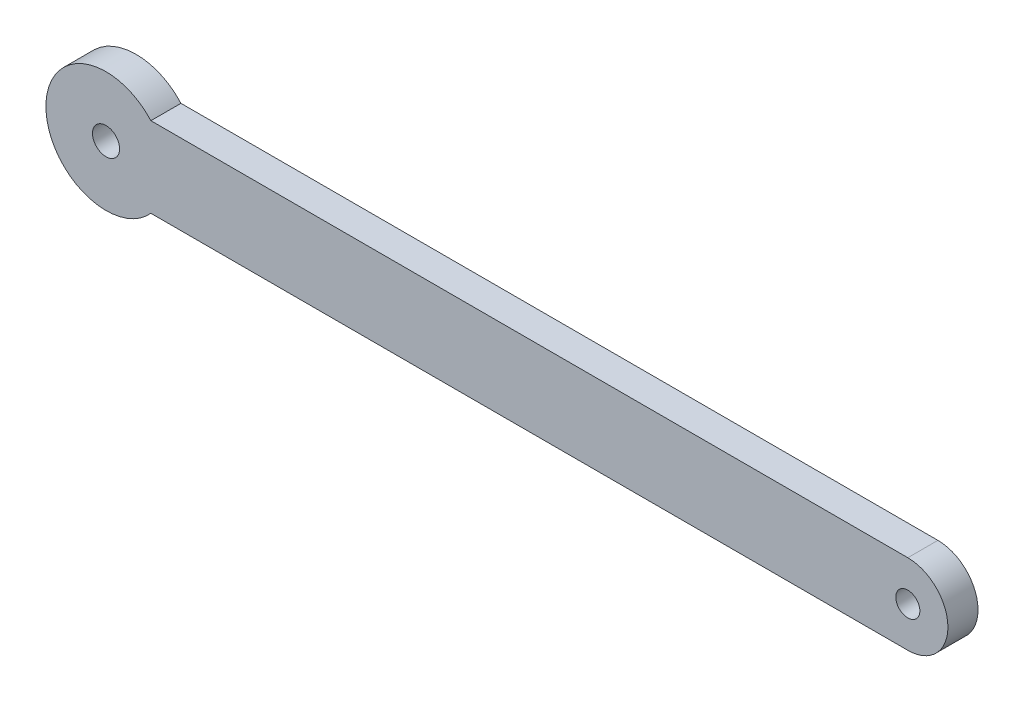
ISO-10303-21;
HEADER;
FILE_DESCRIPTION(('STEP AP214'),'2;1');
FILE_NAME('part.step','',(''),(''),'','','');
FILE_SCHEMA(('AUTOMOTIVE_DESIGN { 1 0 10303 214 1 1 1 1 }'));
ENDSEC;
DATA;
#1=APPLICATION_CONTEXT('core data for automotive mechanical design processes');
#2=APPLICATION_PROTOCOL_DEFINITION('international standard','automotive_design',2000,#1);
#3=PRODUCT_CONTEXT('',#1,'mechanical');
#4=PRODUCT('Part','Part','',(#3));
#5=PRODUCT_RELATED_PRODUCT_CATEGORY('part','',(#4));
#6=PRODUCT_DEFINITION_FORMATION('','',#4);
#7=PRODUCT_DEFINITION_CONTEXT('part definition',#1,'design');
#8=PRODUCT_DEFINITION('design','',#6,#7);
#9=PRODUCT_DEFINITION_SHAPE('','',#8);
#10=(LENGTH_UNIT() NAMED_UNIT(*) SI_UNIT(.MILLI.,.METRE.));
#11=(NAMED_UNIT(*) PLANE_ANGLE_UNIT() SI_UNIT($,.RADIAN.));
#12=(NAMED_UNIT(*) SI_UNIT($,.STERADIAN.) SOLID_ANGLE_UNIT());
#13=UNCERTAINTY_MEASURE_WITH_UNIT(LENGTH_MEASURE(1.E-05),#10,'distance_accuracy_value','');
#14=(GEOMETRIC_REPRESENTATION_CONTEXT(3) GLOBAL_UNCERTAINTY_ASSIGNED_CONTEXT((#13)) GLOBAL_UNIT_ASSIGNED_CONTEXT((#10,
#11,#12)) REPRESENTATION_CONTEXT('',''));
#15=CARTESIAN_POINT('',(0.,0.,0.));
#16=DIRECTION('',(0.,0.,1.));
#17=DIRECTION('',(1.,0.,0.));
#18=AXIS2_PLACEMENT_3D('',#15,#16,#17);
#19=CARTESIAN_POINT('',(-55.9542816064248,3.51409457484091,3.));
#20=DIRECTION('',(0.,0.,-1.));
#21=DIRECTION('',(-1.,0.,0.));
#22=AXIS2_PLACEMENT_3D('',#19,#20,#21);
#23=CYLINDRICAL_SURFACE('',#22,6.00000000000005);
#24=CARTESIAN_POINT('',(-55.9542816064248,3.51409457484091,0.));
#25=DIRECTION('',(0.,0.,-1.));
#26=DIRECTION('',(-1.,0.,0.));
#27=AXIS2_PLACEMENT_3D('',#24,#25,#26);
#28=CIRCLE('',#27,6.00000000000005);
#29=CARTESIAN_POINT('',(-51.4821456514251,-0.485905425159017,0.));
#30=VERTEX_POINT('',#29);
#31=CARTESIAN_POINT('',(-51.4821456514252,7.51409457484098,0.));
#32=VERTEX_POINT('',#31);
#33=EDGE_CURVE('E102',#30,#32,#28,.T.);
#34=ORIENTED_EDGE('',*,*,#33,.F.);
#35=DIRECTION('',(0.,0.,-1.));
#36=VECTOR('',#35,1.);
#37=CARTESIAN_POINT('',(-51.4821456514251,-0.485905425159017,3.));
#38=LINE('',#37,#36);
#39=CARTESIAN_POINT('',(-51.4821456514251,-0.485905425159017,3.));
#40=VERTEX_POINT('',#39);
#41=EDGE_CURVE('E11',#40,#30,#38,.T.);
#42=ORIENTED_EDGE('',*,*,#41,.F.);
#43=CARTESIAN_POINT('',(-55.9542816064248,3.51409457484091,3.));
#44=DIRECTION('',(0.,0.,-1.));
#45=DIRECTION('',(-1.,0.,0.));
#46=AXIS2_PLACEMENT_3D('',#43,#44,#45);
#47=CIRCLE('',#46,6.00000000000005);
#48=CARTESIAN_POINT('',(-51.4821456514252,7.51409457484098,3.));
#49=VERTEX_POINT('',#48);
#50=EDGE_CURVE('E95',#40,#49,#47,.T.);
#51=ORIENTED_EDGE('',*,*,#50,.T.);
#52=DIRECTION('',(0.,0.,-1.));
#53=VECTOR('',#52,1.);
#54=CARTESIAN_POINT('',(-51.4821456514252,7.51409457484098,3.));
#55=LINE('',#54,#53);
#56=EDGE_CURVE('E40',#49,#32,#55,.T.);
#57=ORIENTED_EDGE('',*,*,#56,.T.);
#58=EDGE_LOOP('',(#34,#42,#51,#57));
#59=FACE_BOUND('',#58,.T.);
#60=ADVANCED_FACE('F37',(#59),#23,.T.);
#61=CARTESIAN_POINT('',(24.0193361863372,-0.485905425159017,3.));
#62=DIRECTION('',(0.,-1.,0.));
#63=DIRECTION('',(0.,0.,-1.));
#64=AXIS2_PLACEMENT_3D('',#61,#62,#63);
#65=PLANE('',#64);
#66=DIRECTION('',(-1.,0.,0.));
#67=VECTOR('',#66,1.);
#68=CARTESIAN_POINT('',(24.0193361863372,-0.485905425159017,0.));
#69=LINE('',#68,#67);
#70=CARTESIAN_POINT('',(24.0193361863372,-0.485905425159013,0.));
#71=VERTEX_POINT('',#70);
#72=EDGE_CURVE('E97',#71,#30,#69,.T.);
#73=ORIENTED_EDGE('',*,*,#72,.F.);
#74=DIRECTION('',(0.,0.,-1.));
#75=VECTOR('',#74,1.);
#76=CARTESIAN_POINT('',(24.0193361863372,-0.485905425159013,3.));
#77=LINE('',#76,#75);
#78=CARTESIAN_POINT('',(24.0193361863372,-0.485905425159013,3.));
#79=VERTEX_POINT('',#78);
#80=EDGE_CURVE('E46',#79,#71,#77,.T.);
#81=ORIENTED_EDGE('',*,*,#80,.F.);
#82=DIRECTION('',(-1.,0.,0.));
#83=VECTOR('',#82,1.);
#84=CARTESIAN_POINT('',(24.0193361863372,-0.485905425159017,3.));
#85=LINE('',#84,#83);
#86=EDGE_CURVE('E92',#79,#40,#85,.T.);
#87=ORIENTED_EDGE('',*,*,#86,.T.);
#88=ORIENTED_EDGE('',*,*,#41,.T.);
#89=EDGE_LOOP('',(#73,#81,#87,#88));
#90=FACE_BOUND('',#89,.T.);
#91=ADVANCED_FACE('F113',(#90),#65,.T.);
#92=CARTESIAN_POINT('',(24.0193361863372,3.51409457484099,3.));
#93=DIRECTION('',(0.,0.,-1.));
#94=DIRECTION('',(-1.,0.,0.));
#95=AXIS2_PLACEMENT_3D('',#92,#93,#94);
#96=CYLINDRICAL_SURFACE('',#95,4.);
#97=CARTESIAN_POINT('',(24.0193361863372,3.51409457484099,0.));
#98=DIRECTION('',(0.,0.,-1.));
#99=DIRECTION('',(-1.,0.,0.));
#100=AXIS2_PLACEMENT_3D('',#97,#98,#99);
#101=CIRCLE('',#100,4.);
#102=CARTESIAN_POINT('',(24.0193361863372,7.51409457484098,0.));
#103=VERTEX_POINT('',#102);
#104=EDGE_CURVE('E87',#103,#71,#101,.T.);
#105=ORIENTED_EDGE('',*,*,#104,.F.);
#106=DIRECTION('',(0.,0.,-1.));
#107=VECTOR('',#106,1.);
#108=CARTESIAN_POINT('',(24.0193361863372,7.51409457484098,3.));
#109=LINE('',#108,#107);
#110=CARTESIAN_POINT('',(24.0193361863372,7.51409457484098,3.));
#111=VERTEX_POINT('',#110);
#112=EDGE_CURVE('E82',#111,#103,#109,.T.);
#113=ORIENTED_EDGE('',*,*,#112,.F.);
#114=CARTESIAN_POINT('',(24.0193361863372,3.51409457484099,3.));
#115=DIRECTION('',(0.,0.,-1.));
#116=DIRECTION('',(-1.,0.,0.));
#117=AXIS2_PLACEMENT_3D('',#114,#115,#116);
#118=CIRCLE('',#117,4.);
#119=EDGE_CURVE('E85',#111,#79,#118,.T.);
#120=ORIENTED_EDGE('',*,*,#119,.T.);
#121=ORIENTED_EDGE('',*,*,#80,.T.);
#122=EDGE_LOOP('',(#105,#113,#120,#121));
#123=FACE_BOUND('',#122,.T.);
#124=ADVANCED_FACE('F84',(#123),#96,.T.);
#125=CARTESIAN_POINT('',(-51.4821456514252,7.51409457484098,3.));
#126=DIRECTION('',(0.,1.,0.));
#127=DIRECTION('',(0.,0.,1.));
#128=AXIS2_PLACEMENT_3D('',#125,#126,#127);
#129=PLANE('',#128);
#130=DIRECTION('',(1.,0.,0.));
#131=VECTOR('',#130,1.);
#132=CARTESIAN_POINT('',(-51.4821456514252,7.51409457484098,0.));
#133=LINE('',#132,#131);
#134=EDGE_CURVE('E105',#32,#103,#133,.T.);
#135=ORIENTED_EDGE('',*,*,#134,.F.);
#136=ORIENTED_EDGE('',*,*,#56,.F.);
#137=DIRECTION('',(1.,0.,0.));
#138=VECTOR('',#137,1.);
#139=CARTESIAN_POINT('',(-51.4821456514252,7.51409457484098,3.));
#140=LINE('',#139,#138);
#141=EDGE_CURVE('E91',#49,#111,#140,.T.);
#142=ORIENTED_EDGE('',*,*,#141,.T.);
#143=ORIENTED_EDGE('',*,*,#112,.T.);
#144=EDGE_LOOP('',(#135,#136,#142,#143));
#145=FACE_BOUND('',#144,.T.);
#146=ADVANCED_FACE('F94',(#145),#129,.T.);
#147=CARTESIAN_POINT('',(-55.9542816064248,3.51409457484091,3.));
#148=DIRECTION('',(0.,0.,-1.));
#149=DIRECTION('',(-1.,0.,0.));
#150=AXIS2_PLACEMENT_3D('',#147,#148,#149);
#151=PLANE('',#150);
#152=CARTESIAN_POINT('',(-55.9542816064248,3.51409457484091,3.));
#153=DIRECTION('',(0.,0.,-1.));
#154=DIRECTION('',(1.,0.,0.));
#155=AXIS2_PLACEMENT_3D('',#152,#153,#154);
#156=CIRCLE('',#155,1.35);
#157=CARTESIAN_POINT('',(-54.6042816064248,3.51409457484091,3.));
#158=VERTEX_POINT('',#157);
#159=EDGE_CURVE('E146',#158,#158,#156,.T.);
#160=ORIENTED_EDGE('',*,*,#159,.T.);
#161=EDGE_LOOP('',(#160));
#162=FACE_BOUND('',#161,.T.);
#163=CARTESIAN_POINT('',(24.0203966544439,3.51409457484091,3.));
#164=DIRECTION('',(0.,0.,-1.));
#165=DIRECTION('',(1.,0.,0.));
#166=AXIS2_PLACEMENT_3D('',#163,#164,#165);
#167=CIRCLE('',#166,1.2);
#168=CARTESIAN_POINT('',(25.2203966544439,3.51409457484091,3.));
#169=VERTEX_POINT('',#168);
#170=EDGE_CURVE('E106',#169,#169,#167,.T.);
#171=ORIENTED_EDGE('',*,*,#170,.T.);
#172=EDGE_LOOP('',(#171));
#173=FACE_BOUND('',#172,.T.);
#174=ORIENTED_EDGE('',*,*,#50,.F.);
#175=ORIENTED_EDGE('',*,*,#86,.F.);
#176=ORIENTED_EDGE('',*,*,#119,.F.);
#177=ORIENTED_EDGE('',*,*,#141,.F.);
#178=EDGE_LOOP('',(#174,#175,#176,#177));
#179=FACE_BOUND('',#178,.T.);
#180=ADVANCED_FACE('F90',(#162,#173,#179),#151,.F.);
#181=CARTESIAN_POINT('',(-55.9542816064248,3.51409457484091,0.));
#182=DIRECTION('',(0.,0.,-1.));
#183=DIRECTION('',(-1.,0.,0.));
#184=AXIS2_PLACEMENT_3D('',#181,#182,#183);
#185=PLANE('',#184);
#186=CARTESIAN_POINT('',(-55.9542816064248,3.51409457484091,0.));
#187=DIRECTION('',(0.,0.,-1.));
#188=DIRECTION('',(1.,0.,0.));
#189=AXIS2_PLACEMENT_3D('',#186,#187,#188);
#190=CIRCLE('',#189,1.35);
#191=CARTESIAN_POINT('',(-54.6042816064248,3.51409457484091,0.));
#192=VERTEX_POINT('',#191);
#193=EDGE_CURVE('E149',#192,#192,#190,.T.);
#194=ORIENTED_EDGE('',*,*,#193,.F.);
#195=EDGE_LOOP('',(#194));
#196=FACE_BOUND('',#195,.T.);
#197=CARTESIAN_POINT('',(24.0203966544439,3.51409457484091,0.));
#198=DIRECTION('',(0.,0.,-1.));
#199=DIRECTION('',(1.,0.,0.));
#200=AXIS2_PLACEMENT_3D('',#197,#198,#199);
#201=CIRCLE('',#200,1.2);
#202=CARTESIAN_POINT('',(25.2203966544439,3.51409457484091,0.));
#203=VERTEX_POINT('',#202);
#204=EDGE_CURVE('E151',#203,#203,#201,.T.);
#205=ORIENTED_EDGE('',*,*,#204,.F.);
#206=EDGE_LOOP('',(#205));
#207=FACE_BOUND('',#206,.T.);
#208=ORIENTED_EDGE('',*,*,#33,.T.);
#209=ORIENTED_EDGE('',*,*,#134,.T.);
#210=ORIENTED_EDGE('',*,*,#104,.T.);
#211=ORIENTED_EDGE('',*,*,#72,.T.);
#212=EDGE_LOOP('',(#208,#209,#210,#211));
#213=FACE_BOUND('',#212,.T.);
#214=ADVANCED_FACE('F112',(#196,#207,#213),#185,.T.);
#215=CARTESIAN_POINT('',(24.0203966544439,3.51409457484091,3.));
#216=DIRECTION('',(0.,0.,-1.));
#217=DIRECTION('',(-1.,0.,0.));
#218=AXIS2_PLACEMENT_3D('',#215,#216,#217);
#219=CYLINDRICAL_SURFACE('',#218,1.2);
#220=ORIENTED_EDGE('',*,*,#170,.F.);
#221=EDGE_LOOP('',(#220));
#222=FACE_BOUND('',#221,.T.);
#223=ORIENTED_EDGE('',*,*,#204,.T.);
#224=EDGE_LOOP('',(#223));
#225=FACE_BOUND('',#224,.T.);
#226=ADVANCED_FACE('F131',(#222,#225),#219,.F.);
#227=CARTESIAN_POINT('',(-55.9542816064248,3.51409457484091,3.));
#228=DIRECTION('',(0.,0.,-1.));
#229=DIRECTION('',(-1.,0.,0.));
#230=AXIS2_PLACEMENT_3D('',#227,#228,#229);
#231=CYLINDRICAL_SURFACE('',#230,1.35);
#232=ORIENTED_EDGE('',*,*,#159,.F.);
#233=EDGE_LOOP('',(#232));
#234=FACE_BOUND('',#233,.T.);
#235=ORIENTED_EDGE('',*,*,#193,.T.);
#236=EDGE_LOOP('',(#235));
#237=FACE_BOUND('',#236,.T.);
#238=ADVANCED_FACE('F138',(#234,#237),#231,.F.);
#239=CLOSED_SHELL('',(#60,#91,#124,#146,#180,#214,#226,#238));
#240=MANIFOLD_SOLID_BREP('B2',#239);
#241=ADVANCED_BREP_SHAPE_REPRESENTATION('',(#18,#240),#14);
#242=SHAPE_DEFINITION_REPRESENTATION(#9,#241);
ENDSEC;
END-ISO-10303-21;
